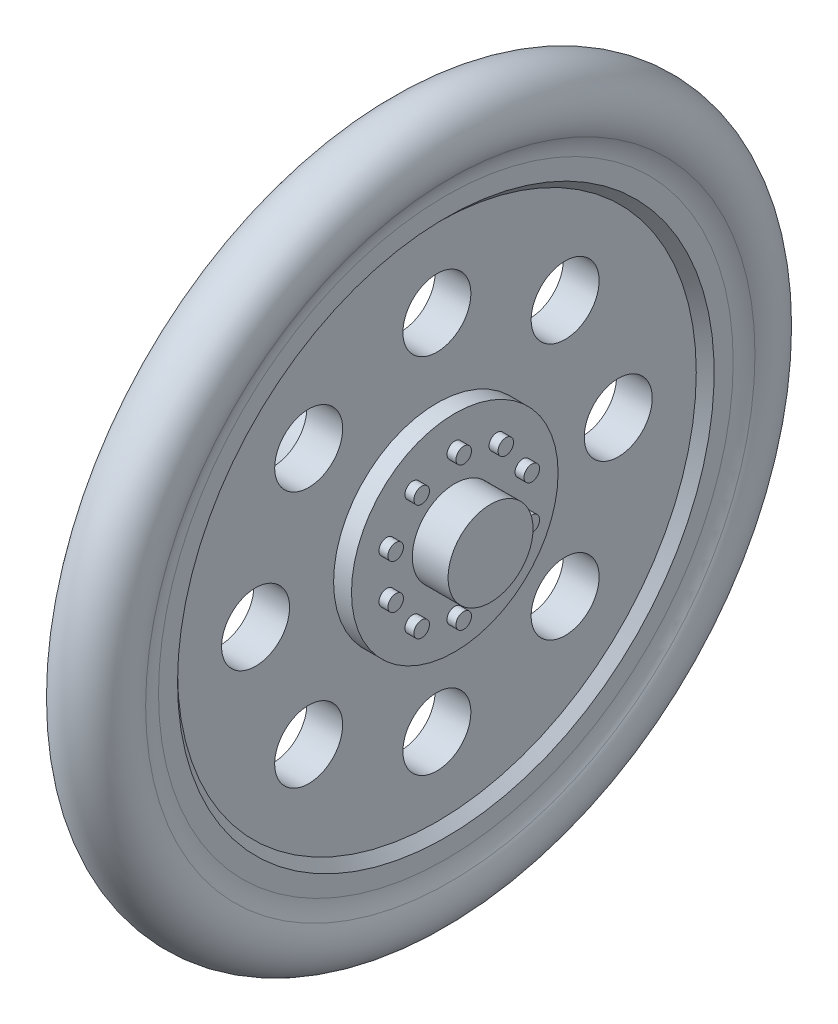
ISO-10303-21;
HEADER;
FILE_DESCRIPTION(('STEP AP214'),'2;1');
FILE_NAME('part.step','',(''),(''),'','','');
FILE_SCHEMA(('AUTOMOTIVE_DESIGN { 1 0 10303 214 1 1 1 1 }'));
ENDSEC;
DATA;
#1=APPLICATION_CONTEXT('core data for automotive mechanical design processes');
#2=APPLICATION_PROTOCOL_DEFINITION('international standard','automotive_design',2000,#1);
#3=PRODUCT_CONTEXT('',#1,'mechanical');
#4=PRODUCT('Part','Part','',(#3));
#5=PRODUCT_RELATED_PRODUCT_CATEGORY('part','',(#4));
#6=PRODUCT_DEFINITION_FORMATION('','',#4);
#7=PRODUCT_DEFINITION_CONTEXT('part definition',#1,'design');
#8=PRODUCT_DEFINITION('design','',#6,#7);
#9=PRODUCT_DEFINITION_SHAPE('','',#8);
#10=(LENGTH_UNIT() NAMED_UNIT(*) SI_UNIT(.MILLI.,.METRE.));
#11=(NAMED_UNIT(*) PLANE_ANGLE_UNIT() SI_UNIT($,.RADIAN.));
#12=(NAMED_UNIT(*) SI_UNIT($,.STERADIAN.) SOLID_ANGLE_UNIT());
#13=UNCERTAINTY_MEASURE_WITH_UNIT(LENGTH_MEASURE(1.E-05),#10,'distance_accuracy_value','');
#14=(GEOMETRIC_REPRESENTATION_CONTEXT(3) GLOBAL_UNCERTAINTY_ASSIGNED_CONTEXT((#13)) GLOBAL_UNIT_ASSIGNED_CONTEXT((#10,
#11,#12)) REPRESENTATION_CONTEXT('',''));
#15=CARTESIAN_POINT('',(0.,0.,0.));
#16=DIRECTION('',(0.,0.,1.));
#17=DIRECTION('',(1.,0.,0.));
#18=AXIS2_PLACEMENT_3D('',#15,#16,#17);
#19=CARTESIAN_POINT('',(10.5,0.,0.));
#20=DIRECTION('',(1.,0.,0.));
#21=DIRECTION('',(0.,0.,-1.));
#22=AXIS2_PLACEMENT_3D('',#19,#20,#21);
#23=PLANE('',#22);
#24=CARTESIAN_POINT('',(10.5,1.23606797749983,-3.8042260651806));
#25=DIRECTION('',(1.,0.,0.));
#26=DIRECTION('',(0.,-0.95105651629515,-0.309016994374958));
#27=AXIS2_PLACEMENT_3D('',#24,#25,#26);
#28=CIRCLE('',#27,0.435);
#29=CARTESIAN_POINT('',(10.5,0.822358392911443,-3.93864845773371));
#30=VERTEX_POINT('',#29);
#31=EDGE_CURVE('E100',#30,#30,#28,.T.);
#32=ORIENTED_EDGE('',*,*,#31,.F.);
#33=EDGE_LOOP('',(#32));
#34=FACE_BOUND('',#33,.T.);
#35=CARTESIAN_POINT('',(10.5,-3.23606797749977,-2.35114100916992));
#36=DIRECTION('',(1.,0.,0.));
#37=DIRECTION('',(0.,-0.58778525229248,0.809016994374942));
#38=AXIS2_PLACEMENT_3D('',#35,#36,#37);
#39=CIRCLE('',#38,0.435);
#40=CARTESIAN_POINT('',(10.5,-3.491754562247,-1.99921861661682));
#41=VERTEX_POINT('',#40);
#42=EDGE_CURVE('E112',#41,#41,#39,.T.);
#43=ORIENTED_EDGE('',*,*,#42,.F.);
#44=EDGE_LOOP('',(#43));
#45=FACE_BOUND('',#44,.T.);
#46=CARTESIAN_POINT('',(10.5,-3.2360679774998,2.35114100916987));
#47=DIRECTION('',(1.,0.,0.));
#48=DIRECTION('',(0.,0.587785252292469,0.809016994374951));
#49=AXIS2_PLACEMENT_3D('',#46,#47,#48);
#50=CIRCLE('',#49,0.435);
#51=CARTESIAN_POINT('',(10.5,-2.98038139275258,2.70306340172298));
#52=VERTEX_POINT('',#51);
#53=EDGE_CURVE('E124',#52,#52,#50,.T.);
#54=ORIENTED_EDGE('',*,*,#53,.F.);
#55=EDGE_LOOP('',(#54));
#56=FACE_BOUND('',#55,.T.);
#57=CARTESIAN_POINT('',(10.5,1.23606797749978,3.80422606518062));
#58=DIRECTION('',(1.,0.,0.));
#59=DIRECTION('',(0.,0.951056516295155,-0.309016994374945));
#60=AXIS2_PLACEMENT_3D('',#57,#58,#59);
#61=CIRCLE('',#60,0.435);
#62=CARTESIAN_POINT('',(10.5,1.64977756208817,3.66980367262752));
#63=VERTEX_POINT('',#62);
#64=EDGE_CURVE('E136',#63,#63,#61,.T.);
#65=ORIENTED_EDGE('',*,*,#64,.F.);
#66=EDGE_LOOP('',(#65));
#67=FACE_BOUND('',#66,.T.);
#68=CARTESIAN_POINT('',(10.5,4.,0.));
#69=DIRECTION('',(1.,0.,0.));
#70=DIRECTION('',(0.,0.,-1.));
#71=AXIS2_PLACEMENT_3D('',#68,#69,#70);
#72=CIRCLE('',#71,0.435);
#73=CARTESIAN_POINT('',(10.5,4.,-0.435));
#74=VERTEX_POINT('',#73);
#75=EDGE_CURVE('E148',#74,#74,#72,.T.);
#76=ORIENTED_EDGE('',*,*,#75,.F.);
#77=EDGE_LOOP('',(#76));
#78=FACE_BOUND('',#77,.T.);
#79=CARTESIAN_POINT('',(10.5,0.,0.));
#80=DIRECTION('',(1.,0.,0.));
#81=DIRECTION('',(0.,0.,-1.));
#82=AXIS2_PLACEMENT_3D('',#79,#80,#81);
#83=CIRCLE('',#82,5.775);
#84=CARTESIAN_POINT('',(10.5,0.,-5.775));
#85=VERTEX_POINT('',#84);
#86=EDGE_CURVE('E160',#85,#85,#83,.T.);
#87=ORIENTED_EDGE('',*,*,#86,.T.);
#88=EDGE_LOOP('',(#87));
#89=FACE_BOUND('',#88,.T.);
#90=CARTESIAN_POINT('',(10.5,0.,0.));
#91=DIRECTION('',(1.,0.,0.));
#92=DIRECTION('',(0.,0.,-1.));
#93=AXIS2_PLACEMENT_3D('',#90,#91,#92);
#94=CIRCLE('',#93,2.375);
#95=CARTESIAN_POINT('',(10.5,0.,-2.375));
#96=VERTEX_POINT('',#95);
#97=EDGE_CURVE('E154',#96,#96,#94,.T.);
#98=ORIENTED_EDGE('',*,*,#97,.F.);
#99=EDGE_LOOP('',(#98));
#100=FACE_BOUND('',#99,.T.);
#101=CARTESIAN_POINT('',(10.5,3.23606797749979,2.3511410091699));
#102=DIRECTION('',(1.,0.,0.));
#103=DIRECTION('',(0.,0.587785252292474,-0.809016994374947));
#104=AXIS2_PLACEMENT_3D('',#101,#102,#103);
#105=CIRCLE('',#104,0.435);
#106=CARTESIAN_POINT('',(10.5,3.49175456224701,1.9992186166168));
#107=VERTEX_POINT('',#106);
#108=EDGE_CURVE('E142',#107,#107,#105,.T.);
#109=ORIENTED_EDGE('',*,*,#108,.F.);
#110=EDGE_LOOP('',(#109));
#111=FACE_BOUND('',#110,.T.);
#112=CARTESIAN_POINT('',(10.5,-1.23606797749981,3.80422606518061));
#113=DIRECTION('',(1.,0.,0.));
#114=DIRECTION('',(0.,0.951056516295152,0.309016994374952));
#115=AXIS2_PLACEMENT_3D('',#112,#113,#114);
#116=CIRCLE('',#115,0.435);
#117=CARTESIAN_POINT('',(10.5,-0.822358392911415,3.93864845773371));
#118=VERTEX_POINT('',#117);
#119=EDGE_CURVE('E130',#118,#118,#116,.T.);
#120=ORIENTED_EDGE('',*,*,#119,.F.);
#121=EDGE_LOOP('',(#120));
#122=FACE_BOUND('',#121,.T.);
#123=CARTESIAN_POINT('',(10.5,-4.,0.));
#124=DIRECTION('',(1.,0.,0.));
#125=DIRECTION('',(0.,0.,1.));
#126=AXIS2_PLACEMENT_3D('',#123,#124,#125);
#127=CIRCLE('',#126,0.435);
#128=CARTESIAN_POINT('',(10.5,-4.,0.434999999999972));
#129=VERTEX_POINT('',#128);
#130=EDGE_CURVE('E118',#129,#129,#127,.T.);
#131=ORIENTED_EDGE('',*,*,#130,.F.);
#132=EDGE_LOOP('',(#131));
#133=FACE_BOUND('',#132,.T.);
#134=CARTESIAN_POINT('',(10.5,-1.23606797749975,-3.80422606518063));
#135=DIRECTION('',(1.,0.,0.));
#136=DIRECTION('',(0.,-0.951056516295157,0.309016994374938));
#137=AXIS2_PLACEMENT_3D('',#134,#135,#136);
#138=CIRCLE('',#137,0.435);
#139=CARTESIAN_POINT('',(10.5,-1.64977756208815,-3.66980367262753));
#140=VERTEX_POINT('',#139);
#141=EDGE_CURVE('E106',#140,#140,#138,.T.);
#142=ORIENTED_EDGE('',*,*,#141,.F.);
#143=EDGE_LOOP('',(#142));
#144=FACE_BOUND('',#143,.T.);
#145=CARTESIAN_POINT('',(10.5,3.23606797749982,-2.35114100916985));
#146=DIRECTION('',(1.,0.,0.));
#147=DIRECTION('',(0.,-0.587785252292462,-0.809016994374955));
#148=AXIS2_PLACEMENT_3D('',#145,#146,#147);
#149=CIRCLE('',#148,0.435);
#150=CARTESIAN_POINT('',(10.5,2.9803813927526,-2.70306340172296));
#151=VERTEX_POINT('',#150);
#152=EDGE_CURVE('E50',#151,#151,#149,.T.);
#153=ORIENTED_EDGE('',*,*,#152,.F.);
#154=EDGE_LOOP('',(#153));
#155=FACE_BOUND('',#154,.T.);
#156=ADVANCED_FACE('F30',(#34,#45,#56,#67,#78,#89,#100,#111,#122,#133,#144,#155),#23,.T.);
#157=CARTESIAN_POINT('',(9.5,14.5,0.));
#158=DIRECTION('',(-1.,0.,0.));
#159=DIRECTION('',(0.,0.,1.));
#160=AXIS2_PLACEMENT_3D('',#157,#158,#159);
#161=PLANE('',#160);
#162=CARTESIAN_POINT('',(9.5,7.16829499427871,-7.16829499427854));
#163=DIRECTION('',(1.,0.,0.));
#164=DIRECTION('',(0.,-0.707106781186539,-0.707106781186556));
#165=AXIS2_PLACEMENT_3D('',#162,#163,#164);
#166=CIRCLE('',#165,1.9);
#167=CARTESIAN_POINT('',(9.5,5.82479211002429,-8.511797878533));
#168=VERTEX_POINT('',#167);
#169=EDGE_CURVE('E83',#168,#168,#166,.T.);
#170=ORIENTED_EDGE('',*,*,#169,.F.);
#171=EDGE_LOOP('',(#170));
#172=FACE_BOUND('',#171,.T.);
#173=CARTESIAN_POINT('',(9.5,1.06184737719739E-13,-10.1375));
#174=DIRECTION('',(1.,0.,0.));
#175=DIRECTION('',(0.,-1.,0.));
#176=AXIS2_PLACEMENT_3D('',#173,#174,#175);
#177=CIRCLE('',#176,1.9);
#178=CARTESIAN_POINT('',(9.5,-1.8999999999999,-10.1375));
#179=VERTEX_POINT('',#178);
#180=EDGE_CURVE('E73',#179,#179,#177,.T.);
#181=ORIENTED_EDGE('',*,*,#180,.F.);
#182=EDGE_LOOP('',(#181));
#183=FACE_BOUND('',#182,.T.);
#184=CARTESIAN_POINT('',(9.5,-7.16829499427856,-7.16829499427869));
#185=DIRECTION('',(1.,0.,0.));
#186=DIRECTION('',(0.,-0.707106781186554,0.707106781186541));
#187=AXIS2_PLACEMENT_3D('',#184,#185,#186);
#188=CIRCLE('',#187,1.9);
#189=CARTESIAN_POINT('',(9.5,-8.51179787853301,-5.82479211002426));
#190=VERTEX_POINT('',#189);
#191=EDGE_CURVE('E70',#190,#190,#188,.T.);
#192=ORIENTED_EDGE('',*,*,#191,.F.);
#193=EDGE_LOOP('',(#192));
#194=FACE_BOUND('',#193,.T.);
#195=CARTESIAN_POINT('',(9.5,-10.1375,0.));
#196=DIRECTION('',(1.,0.,0.));
#197=DIRECTION('',(0.,0.,1.));
#198=AXIS2_PLACEMENT_3D('',#195,#196,#197);
#199=CIRCLE('',#198,1.9);
#200=CARTESIAN_POINT('',(9.5,-10.1375,1.89999999999993));
#201=VERTEX_POINT('',#200);
#202=EDGE_CURVE('E67',#201,#201,#199,.T.);
#203=ORIENTED_EDGE('',*,*,#202,.F.);
#204=EDGE_LOOP('',(#203));
#205=FACE_BOUND('',#204,.T.);
#206=CARTESIAN_POINT('',(9.5,-7.16829499427866,7.16829499427859));
#207=DIRECTION('',(1.,0.,0.));
#208=DIRECTION('',(0.,0.707106781186544,0.707106781186551));
#209=AXIS2_PLACEMENT_3D('',#206,#207,#208);
#210=CIRCLE('',#209,1.9);
#211=CARTESIAN_POINT('',(9.5,-5.82479211002423,8.51179787853304));
#212=VERTEX_POINT('',#211);
#213=EDGE_CURVE('E63',#212,#212,#210,.T.);
#214=ORIENTED_EDGE('',*,*,#213,.F.);
#215=EDGE_LOOP('',(#214));
#216=FACE_BOUND('',#215,.T.);
#217=CARTESIAN_POINT('',(9.5,0.,10.1375));
#218=DIRECTION('',(1.,0.,0.));
#219=DIRECTION('',(0.,1.,0.));
#220=AXIS2_PLACEMENT_3D('',#217,#218,#219);
#221=CIRCLE('',#220,1.9);
#222=CARTESIAN_POINT('',(9.5,1.89999999999997,10.1375));
#223=VERTEX_POINT('',#222);
#224=EDGE_CURVE('E59',#223,#223,#221,.T.);
#225=ORIENTED_EDGE('',*,*,#224,.F.);
#226=EDGE_LOOP('',(#225));
#227=FACE_BOUND('',#226,.T.);
#228=CARTESIAN_POINT('',(9.5,7.16829499427861,7.16829499427864));
#229=DIRECTION('',(1.,0.,0.));
#230=DIRECTION('',(0.,0.707106781186549,-0.707106781186546));
#231=AXIS2_PLACEMENT_3D('',#228,#229,#230);
#232=CIRCLE('',#231,1.9);
#233=CARTESIAN_POINT('',(9.5,8.51179787853306,5.8247921100242));
#234=VERTEX_POINT('',#233);
#235=EDGE_CURVE('E55',#234,#234,#232,.T.);
#236=ORIENTED_EDGE('',*,*,#235,.F.);
#237=EDGE_LOOP('',(#236));
#238=FACE_BOUND('',#237,.T.);
#239=CARTESIAN_POINT('',(9.5,10.1375,0.));
#240=DIRECTION('',(1.,0.,0.));
#241=DIRECTION('',(0.,0.,-1.));
#242=AXIS2_PLACEMENT_3D('',#239,#240,#241);
#243=CIRCLE('',#242,1.9);
#244=CARTESIAN_POINT('',(9.5,10.1375,-1.9));
#245=VERTEX_POINT('',#244);
#246=EDGE_CURVE('E51',#245,#245,#243,.T.);
#247=ORIENTED_EDGE('',*,*,#246,.F.);
#248=EDGE_LOOP('',(#247));
#249=FACE_BOUND('',#248,.T.);
#250=CARTESIAN_POINT('',(9.5,0.,0.));
#251=DIRECTION('',(-1.,0.,0.));
#252=DIRECTION('',(0.,0.,1.));
#253=AXIS2_PLACEMENT_3D('',#250,#251,#252);
#254=CIRCLE('',#253,14.5);
#255=CARTESIAN_POINT('',(9.5,0.,14.5));
#256=VERTEX_POINT('',#255);
#257=EDGE_CURVE('E180',#256,#256,#254,.T.);
#258=ORIENTED_EDGE('',*,*,#257,.F.);
#259=EDGE_LOOP('',(#258));
#260=FACE_BOUND('',#259,.T.);
#261=CARTESIAN_POINT('',(9.5,0.,0.));
#262=DIRECTION('',(-1.,0.,0.));
#263=DIRECTION('',(0.,0.,1.));
#264=AXIS2_PLACEMENT_3D('',#261,#262,#263);
#265=CIRCLE('',#264,5.775);
#266=CARTESIAN_POINT('',(9.5,0.,5.775));
#267=VERTEX_POINT('',#266);
#268=EDGE_CURVE('E11',#267,#267,#265,.F.);
#269=ORIENTED_EDGE('',*,*,#268,.F.);
#270=EDGE_LOOP('',(#269));
#271=FACE_BOUND('',#270,.T.);
#272=ADVANCED_FACE('F218',(#172,#183,#194,#205,#216,#227,#238,#249,#260,#271),#161,.F.);
#273=CARTESIAN_POINT('',(0.,0.,0.));
#274=DIRECTION('',(1.,0.,0.));
#275=DIRECTION('',(0.,0.,-1.));
#276=AXIS2_PLACEMENT_3D('',#273,#274,#275);
#277=PLANE('',#276);
#278=CARTESIAN_POINT('',(0.,0.,0.));
#279=DIRECTION('',(-1.,0.,0.));
#280=DIRECTION('',(0.,0.,1.));
#281=AXIS2_PLACEMENT_3D('',#278,#279,#280);
#282=CIRCLE('',#281,1.63);
#283=CARTESIAN_POINT('',(0.,0.,1.63));
#284=VERTEX_POINT('',#283);
#285=EDGE_CURVE('E636',#284,#284,#282,.T.);
#286=ORIENTED_EDGE('',*,*,#285,.F.);
#287=EDGE_LOOP('',(#286));
#288=FACE_BOUND('',#287,.T.);
#289=CARTESIAN_POINT('',(0.,0.,0.));
#290=DIRECTION('',(-1.,0.,0.));
#291=DIRECTION('',(0.,0.,1.));
#292=AXIS2_PLACEMENT_3D('',#289,#290,#291);
#293=CIRCLE('',#292,3.1);
#294=CARTESIAN_POINT('',(0.,0.,3.1));
#295=VERTEX_POINT('',#294);
#296=EDGE_CURVE('E165',#295,#295,#293,.T.);
#297=ORIENTED_EDGE('',*,*,#296,.T.);
#298=EDGE_LOOP('',(#297));
#299=FACE_BOUND('',#298,.T.);
#300=ADVANCED_FACE('F224',(#288,#299),#277,.F.);
#301=CARTESIAN_POINT('',(9.5,0.,0.));
#302=DIRECTION('',(1.,0.,0.));
#303=DIRECTION('',(0.,0.,-1.));
#304=AXIS2_PLACEMENT_3D('',#301,#302,#303);
#305=CONICAL_SURFACE('',#304,14.5,0.785398163397455);
#306=CARTESIAN_POINT('',(10.,0.,0.));
#307=DIRECTION('',(-1.,0.,0.));
#308=DIRECTION('',(0.,0.,1.));
#309=AXIS2_PLACEMENT_3D('',#306,#307,#308);
#310=CIRCLE('',#309,15.);
#311=CARTESIAN_POINT('',(10.,0.,15.));
#312=VERTEX_POINT('',#311);
#313=EDGE_CURVE('E177',#312,#312,#310,.T.);
#314=ORIENTED_EDGE('',*,*,#313,.F.);
#315=EDGE_LOOP('',(#314));
#316=FACE_BOUND('',#315,.T.);
#317=ORIENTED_EDGE('',*,*,#257,.T.);
#318=EDGE_LOOP('',(#317));
#319=FACE_BOUND('',#318,.T.);
#320=ADVANCED_FACE('F248',(#316,#319),#305,.F.);
#321=CARTESIAN_POINT('',(10.,16.6771243444677,0.));
#322=DIRECTION('',(-1.,0.,0.));
#323=DIRECTION('',(0.,0.,1.));
#324=AXIS2_PLACEMENT_3D('',#321,#322,#323);
#325=PLANE('',#324);
#326=CARTESIAN_POINT('',(10.,0.,0.));
#327=DIRECTION('',(-1.,0.,0.));
#328=DIRECTION('',(0.,0.,1.));
#329=AXIS2_PLACEMENT_3D('',#326,#327,#328);
#330=CIRCLE('',#329,16.0635083268963);
#331=CARTESIAN_POINT('',(10.,0.,16.0635083268963));
#332=VERTEX_POINT('',#331);
#333=EDGE_CURVE('E38',#332,#332,#330,.F.);
#334=ORIENTED_EDGE('',*,*,#333,.T.);
#335=EDGE_LOOP('',(#334));
#336=FACE_BOUND('',#335,.T.);
#337=ORIENTED_EDGE('',*,*,#313,.T.);
#338=EDGE_LOOP('',(#337));
#339=FACE_BOUND('',#338,.T.);
#340=ADVANCED_FACE('F254',(#336,#339),#325,.F.);
#341=CARTESIAN_POINT('',(8.5,0.,0.));
#342=DIRECTION('',(-1.,0.,0.));
#343=DIRECTION('',(0.,0.,1.));
#344=AXIS2_PLACEMENT_3D('',#341,#342,#343);
#345=TOROIDAL_SURFACE('',#344,18.,2.);
#346=CARTESIAN_POINT('',(6.75000000000013,0.,0.));
#347=DIRECTION('',(1.,0.,0.));
#348=DIRECTION('',(0.,0.,-1.));
#349=AXIS2_PLACEMENT_3D('',#346,#347,#348);
#350=CIRCLE('',#349,17.0317541634482);
#351=CARTESIAN_POINT('',(6.75000000000013,0.,-17.0317541634482));
#352=VERTEX_POINT('',#351);
#353=EDGE_CURVE('E43',#352,#352,#350,.T.);
#354=ORIENTED_EDGE('',*,*,#353,.T.);
#355=EDGE_LOOP('',(#354));
#356=FACE_BOUND('',#355,.T.);
#357=CARTESIAN_POINT('',(10.2499999999999,0.,0.));
#358=DIRECTION('',(-1.,0.,0.));
#359=DIRECTION('',(0.,0.,1.));
#360=AXIS2_PLACEMENT_3D('',#357,#358,#359);
#361=CIRCLE('',#360,17.0317541634482);
#362=CARTESIAN_POINT('',(10.2499999999999,0.,17.0317541634482));
#363=VERTEX_POINT('',#362);
#364=EDGE_CURVE('E186',#363,#363,#361,.T.);
#365=ORIENTED_EDGE('',*,*,#364,.T.);
#366=EDGE_LOOP('',(#365));
#367=FACE_BOUND('',#366,.T.);
#368=ADVANCED_FACE('F191',(#356,#367),#345,.T.);
#369=CARTESIAN_POINT('',(7.,16.6771243444677,0.));
#370=DIRECTION('',(1.,0.,0.));
#371=DIRECTION('',(0.,0.,-1.));
#372=AXIS2_PLACEMENT_3D('',#369,#370,#371);
#373=PLANE('',#372);
#374=CARTESIAN_POINT('',(7.,0.,0.));
#375=DIRECTION('',(1.,0.,0.));
#376=DIRECTION('',(0.,0.,-1.));
#377=AXIS2_PLACEMENT_3D('',#374,#375,#376);
#378=CIRCLE('',#377,16.0635083268963);
#379=CARTESIAN_POINT('',(7.,0.,-16.0635083268963));
#380=VERTEX_POINT('',#379);
#381=EDGE_CURVE('E183',#380,#380,#378,.F.);
#382=ORIENTED_EDGE('',*,*,#381,.T.);
#383=EDGE_LOOP('',(#382));
#384=FACE_BOUND('',#383,.T.);
#385=CARTESIAN_POINT('',(7.,0.,0.));
#386=DIRECTION('',(-1.,0.,0.));
#387=DIRECTION('',(0.,0.,1.));
#388=AXIS2_PLACEMENT_3D('',#385,#386,#387);
#389=CIRCLE('',#388,15.);
#390=CARTESIAN_POINT('',(7.,0.,15.));
#391=VERTEX_POINT('',#390);
#392=EDGE_CURVE('E174',#391,#391,#389,.T.);
#393=ORIENTED_EDGE('',*,*,#392,.F.);
#394=EDGE_LOOP('',(#393));
#395=FACE_BOUND('',#394,.T.);
#396=ADVANCED_FACE('F200',(#384,#395),#373,.F.);
#397=CARTESIAN_POINT('',(7.,0.,0.));
#398=DIRECTION('',(-1.,0.,0.));
#399=DIRECTION('',(0.,0.,1.));
#400=AXIS2_PLACEMENT_3D('',#397,#398,#399);
#401=CONICAL_SURFACE('',#400,15.,0.785398163397453);
#402=CARTESIAN_POINT('',(7.5,0.,0.));
#403=DIRECTION('',(-1.,0.,0.));
#404=DIRECTION('',(0.,0.,1.));
#405=AXIS2_PLACEMENT_3D('',#402,#403,#404);
#406=CIRCLE('',#405,14.5);
#407=CARTESIAN_POINT('',(7.5,0.,14.5));
#408=VERTEX_POINT('',#407);
#409=EDGE_CURVE('E171',#408,#408,#406,.T.);
#410=ORIENTED_EDGE('',*,*,#409,.F.);
#411=EDGE_LOOP('',(#410));
#412=FACE_BOUND('',#411,.T.);
#413=ORIENTED_EDGE('',*,*,#392,.T.);
#414=EDGE_LOOP('',(#413));
#415=FACE_BOUND('',#414,.T.);
#416=ADVANCED_FACE('F203',(#412,#415),#401,.F.);
#417=CARTESIAN_POINT('',(7.5,3.1,0.));
#418=DIRECTION('',(1.,0.,0.));
#419=DIRECTION('',(0.,0.,-1.));
#420=AXIS2_PLACEMENT_3D('',#417,#418,#419);
#421=PLANE('',#420);
#422=CARTESIAN_POINT('',(7.5,7.16829499427871,-7.16829499427854));
#423=DIRECTION('',(1.,0.,0.));
#424=DIRECTION('',(0.,0.,-1.));
#425=AXIS2_PLACEMENT_3D('',#422,#423,#424);
#426=CIRCLE('',#425,1.9);
#427=CARTESIAN_POINT('',(7.5,7.16829499427871,-9.06829499427854));
#428=VERTEX_POINT('',#427);
#429=EDGE_CURVE('E34',#428,#428,#426,.T.);
#430=ORIENTED_EDGE('',*,*,#429,.T.);
#431=EDGE_LOOP('',(#430));
#432=FACE_BOUND('',#431,.T.);
#433=CARTESIAN_POINT('',(7.5,1.06184737719739E-13,-10.1375));
#434=DIRECTION('',(1.,0.,0.));
#435=DIRECTION('',(0.,0.,-1.));
#436=AXIS2_PLACEMENT_3D('',#433,#434,#435);
#437=CIRCLE('',#436,1.9);
#438=CARTESIAN_POINT('',(7.5,1.06184737719739E-13,-12.0375));
#439=VERTEX_POINT('',#438);
#440=EDGE_CURVE('E71',#439,#439,#437,.T.);
#441=ORIENTED_EDGE('',*,*,#440,.T.);
#442=EDGE_LOOP('',(#441));
#443=FACE_BOUND('',#442,.T.);
#444=CARTESIAN_POINT('',(7.5,-7.16829499427856,-7.16829499427869));
#445=DIRECTION('',(1.,0.,0.));
#446=DIRECTION('',(0.,0.,-1.));
#447=AXIS2_PLACEMENT_3D('',#444,#445,#446);
#448=CIRCLE('',#447,1.9);
#449=CARTESIAN_POINT('',(7.5,-7.16829499427856,-9.06829499427869));
#450=VERTEX_POINT('',#449);
#451=EDGE_CURVE('E68',#450,#450,#448,.T.);
#452=ORIENTED_EDGE('',*,*,#451,.T.);
#453=EDGE_LOOP('',(#452));
#454=FACE_BOUND('',#453,.T.);
#455=CARTESIAN_POINT('',(7.5,-10.1375,0.));
#456=DIRECTION('',(1.,0.,0.));
#457=DIRECTION('',(0.,0.,-1.));
#458=AXIS2_PLACEMENT_3D('',#455,#456,#457);
#459=CIRCLE('',#458,1.9);
#460=CARTESIAN_POINT('',(7.5,-10.1375,-1.90000000000007));
#461=VERTEX_POINT('',#460);
#462=EDGE_CURVE('E64',#461,#461,#459,.T.);
#463=ORIENTED_EDGE('',*,*,#462,.T.);
#464=EDGE_LOOP('',(#463));
#465=FACE_BOUND('',#464,.T.);
#466=CARTESIAN_POINT('',(7.5,-7.16829499427866,7.16829499427859));
#467=DIRECTION('',(1.,0.,0.));
#468=DIRECTION('',(0.,0.,-1.));
#469=AXIS2_PLACEMENT_3D('',#466,#467,#468);
#470=CIRCLE('',#469,1.9);
#471=CARTESIAN_POINT('',(7.5,-7.16829499427866,5.26829499427858));
#472=VERTEX_POINT('',#471);
#473=EDGE_CURVE('E60',#472,#472,#470,.T.);
#474=ORIENTED_EDGE('',*,*,#473,.T.);
#475=EDGE_LOOP('',(#474));
#476=FACE_BOUND('',#475,.T.);
#477=CARTESIAN_POINT('',(7.5,0.,10.1375));
#478=DIRECTION('',(1.,0.,0.));
#479=DIRECTION('',(0.,0.,-1.));
#480=AXIS2_PLACEMENT_3D('',#477,#478,#479);
#481=CIRCLE('',#480,1.9);
#482=CARTESIAN_POINT('',(7.5,0.,8.2375));
#483=VERTEX_POINT('',#482);
#484=EDGE_CURVE('E56',#483,#483,#481,.T.);
#485=ORIENTED_EDGE('',*,*,#484,.T.);
#486=EDGE_LOOP('',(#485));
#487=FACE_BOUND('',#486,.T.);
#488=CARTESIAN_POINT('',(7.5,7.16829499427861,7.16829499427864));
#489=DIRECTION('',(1.,0.,0.));
#490=DIRECTION('',(0.,0.,-1.));
#491=AXIS2_PLACEMENT_3D('',#488,#489,#490);
#492=CIRCLE('',#491,1.9);
#493=CARTESIAN_POINT('',(7.5,7.16829499427861,5.26829499427863));
#494=VERTEX_POINT('',#493);
#495=EDGE_CURVE('E52',#494,#494,#492,.T.);
#496=ORIENTED_EDGE('',*,*,#495,.T.);
#497=EDGE_LOOP('',(#496));
#498=FACE_BOUND('',#497,.T.);
#499=CARTESIAN_POINT('',(7.5,10.1375,0.));
#500=DIRECTION('',(1.,0.,0.));
#501=DIRECTION('',(0.,0.,-1.));
#502=AXIS2_PLACEMENT_3D('',#499,#500,#501);
#503=CIRCLE('',#502,1.9);
#504=CARTESIAN_POINT('',(7.5,10.1375,-1.9));
#505=VERTEX_POINT('',#504);
#506=EDGE_CURVE('E47',#505,#505,#503,.T.);
#507=ORIENTED_EDGE('',*,*,#506,.T.);
#508=EDGE_LOOP('',(#507));
#509=FACE_BOUND('',#508,.T.);
#510=CARTESIAN_POINT('',(7.5,0.,0.));
#511=DIRECTION('',(-1.,0.,0.));
#512=DIRECTION('',(0.,0.,1.));
#513=AXIS2_PLACEMENT_3D('',#510,#511,#512);
#514=CIRCLE('',#513,3.1);
#515=CARTESIAN_POINT('',(7.5,0.,3.1));
#516=VERTEX_POINT('',#515);
#517=EDGE_CURVE('E168',#516,#516,#514,.T.);
#518=ORIENTED_EDGE('',*,*,#517,.F.);
#519=EDGE_LOOP('',(#518));
#520=FACE_BOUND('',#519,.T.);
#521=ORIENTED_EDGE('',*,*,#409,.T.);
#522=EDGE_LOOP('',(#521));
#523=FACE_BOUND('',#522,.T.);
#524=ADVANCED_FACE('F208',(#432,#443,#454,#465,#476,#487,#498,#509,#520,#523),#421,.F.);
#525=CARTESIAN_POINT('',(0.,0.,0.));
#526=DIRECTION('',(-1.,0.,0.));
#527=DIRECTION('',(0.,0.,1.));
#528=AXIS2_PLACEMENT_3D('',#525,#526,#527);
#529=CYLINDRICAL_SURFACE('',#528,3.1);
#530=ORIENTED_EDGE('',*,*,#296,.F.);
#531=EDGE_LOOP('',(#530));
#532=FACE_BOUND('',#531,.T.);
#533=ORIENTED_EDGE('',*,*,#517,.T.);
#534=EDGE_LOOP('',(#533));
#535=FACE_BOUND('',#534,.T.);
#536=ADVANCED_FACE('F197',(#532,#535),#529,.T.);
#537=CARTESIAN_POINT('',(5.,0.,0.));
#538=DIRECTION('',(-1.,0.,0.));
#539=DIRECTION('',(0.,0.,1.));
#540=AXIS2_PLACEMENT_3D('',#537,#538,#539);
#541=TOROIDAL_SURFACE('',#540,16.0635083268963,2.);
#542=ORIENTED_EDGE('',*,*,#353,.F.);
#543=EDGE_LOOP('',(#542));
#544=FACE_BOUND('',#543,.T.);
#545=ORIENTED_EDGE('',*,*,#381,.F.);
#546=EDGE_LOOP('',(#545));
#547=FACE_BOUND('',#546,.T.);
#548=ADVANCED_FACE('F194',(#544,#547),#541,.F.);
#549=CARTESIAN_POINT('',(12.,0.,0.));
#550=DIRECTION('',(1.,0.,0.));
#551=DIRECTION('',(0.,0.,-1.));
#552=AXIS2_PLACEMENT_3D('',#549,#550,#551);
#553=TOROIDAL_SURFACE('',#552,16.0635083268963,2.);
#554=ORIENTED_EDGE('',*,*,#333,.F.);
#555=EDGE_LOOP('',(#554));
#556=FACE_BOUND('',#555,.T.);
#557=ORIENTED_EDGE('',*,*,#364,.F.);
#558=EDGE_LOOP('',(#557));
#559=FACE_BOUND('',#558,.T.);
#560=ADVANCED_FACE('F32',(#556,#559),#553,.F.);
#561=CARTESIAN_POINT('',(10.5,0.,0.));
#562=DIRECTION('',(-1.,0.,0.));
#563=DIRECTION('',(0.,0.,1.));
#564=AXIS2_PLACEMENT_3D('',#561,#562,#563);
#565=CYLINDRICAL_SURFACE('',#564,5.775);
#566=ORIENTED_EDGE('',*,*,#86,.F.);
#567=EDGE_LOOP('',(#566));
#568=FACE_BOUND('',#567,.T.);
#569=ORIENTED_EDGE('',*,*,#268,.T.);
#570=EDGE_LOOP('',(#569));
#571=FACE_BOUND('',#570,.T.);
#572=ADVANCED_FACE('F233',(#568,#571),#565,.T.);
#573=CARTESIAN_POINT('',(12.5,0.,0.));
#574=DIRECTION('',(-1.,0.,0.));
#575=DIRECTION('',(0.,0.,1.));
#576=AXIS2_PLACEMENT_3D('',#573,#574,#575);
#577=CYLINDRICAL_SURFACE('',#576,2.375);
#578=CARTESIAN_POINT('',(12.5,0.,0.));
#579=DIRECTION('',(1.,0.,0.));
#580=DIRECTION('',(0.,0.,-1.));
#581=AXIS2_PLACEMENT_3D('',#578,#579,#580);
#582=CIRCLE('',#581,2.375);
#583=CARTESIAN_POINT('',(12.5,0.,-2.375));
#584=VERTEX_POINT('',#583);
#585=EDGE_CURVE('E157',#584,#584,#582,.T.);
#586=ORIENTED_EDGE('',*,*,#585,.F.);
#587=EDGE_LOOP('',(#586));
#588=FACE_BOUND('',#587,.T.);
#589=ORIENTED_EDGE('',*,*,#97,.T.);
#590=EDGE_LOOP('',(#589));
#591=FACE_BOUND('',#590,.T.);
#592=ADVANCED_FACE('F231',(#588,#591),#577,.T.);
#593=CARTESIAN_POINT('',(12.5,0.,0.));
#594=DIRECTION('',(1.,0.,0.));
#595=DIRECTION('',(0.,0.,-1.));
#596=AXIS2_PLACEMENT_3D('',#593,#594,#595);
#597=PLANE('',#596);
#598=ORIENTED_EDGE('',*,*,#585,.T.);
#599=EDGE_LOOP('',(#598));
#600=FACE_BOUND('',#599,.T.);
#601=ADVANCED_FACE('F303',(#600),#597,.T.);
#602=CARTESIAN_POINT('',(11.,4.,0.));
#603=DIRECTION('',(-1.,0.,0.));
#604=DIRECTION('',(0.,0.,1.));
#605=AXIS2_PLACEMENT_3D('',#602,#603,#604);
#606=CYLINDRICAL_SURFACE('',#605,0.435);
#607=CARTESIAN_POINT('',(11.,4.,0.));
#608=DIRECTION('',(1.,0.,0.));
#609=DIRECTION('',(0.,0.,-1.));
#610=AXIS2_PLACEMENT_3D('',#607,#608,#609);
#611=CIRCLE('',#610,0.435);
#612=CARTESIAN_POINT('',(11.,4.,-0.435));
#613=VERTEX_POINT('',#612);
#614=EDGE_CURVE('E151',#613,#613,#611,.T.);
#615=ORIENTED_EDGE('',*,*,#614,.F.);
#616=EDGE_LOOP('',(#615));
#617=FACE_BOUND('',#616,.T.);
#618=ORIENTED_EDGE('',*,*,#75,.T.);
#619=EDGE_LOOP('',(#618));
#620=FACE_BOUND('',#619,.T.);
#621=ADVANCED_FACE('F312',(#617,#620),#606,.T.);
#622=CARTESIAN_POINT('',(11.,4.,0.));
#623=DIRECTION('',(1.,0.,0.));
#624=DIRECTION('',(0.,0.,-1.));
#625=AXIS2_PLACEMENT_3D('',#622,#623,#624);
#626=PLANE('',#625);
#627=ORIENTED_EDGE('',*,*,#614,.T.);
#628=EDGE_LOOP('',(#627));
#629=FACE_BOUND('',#628,.T.);
#630=ADVANCED_FACE('F321',(#629),#626,.T.);
#631=CARTESIAN_POINT('',(11.,3.23606797749979,2.3511410091699));
#632=DIRECTION('',(-1.,0.,0.));
#633=DIRECTION('',(0.,0.,1.));
#634=AXIS2_PLACEMENT_3D('',#631,#632,#633);
#635=CYLINDRICAL_SURFACE('',#634,0.435);
#636=CARTESIAN_POINT('',(11.,3.23606797749979,2.3511410091699));
#637=DIRECTION('',(1.,0.,0.));
#638=DIRECTION('',(0.,0.587785252292474,-0.809016994374947));
#639=AXIS2_PLACEMENT_3D('',#636,#637,#638);
#640=CIRCLE('',#639,0.435);
#641=CARTESIAN_POINT('',(11.,3.49175456224701,1.9992186166168));
#642=VERTEX_POINT('',#641);
#643=EDGE_CURVE('E145',#642,#642,#640,.T.);
#644=ORIENTED_EDGE('',*,*,#643,.F.);
#645=EDGE_LOOP('',(#644));
#646=FACE_BOUND('',#645,.T.);
#647=ORIENTED_EDGE('',*,*,#108,.T.);
#648=EDGE_LOOP('',(#647));
#649=FACE_BOUND('',#648,.T.);
#650=ADVANCED_FACE('F330',(#646,#649),#635,.T.);
#651=CARTESIAN_POINT('',(11.,3.23606797749979,2.3511410091699));
#652=DIRECTION('',(1.,0.,0.));
#653=DIRECTION('',(0.,0.587785252292474,-0.809016994374947));
#654=AXIS2_PLACEMENT_3D('',#651,#652,#653);
#655=PLANE('',#654);
#656=ORIENTED_EDGE('',*,*,#643,.T.);
#657=EDGE_LOOP('',(#656));
#658=FACE_BOUND('',#657,.T.);
#659=ADVANCED_FACE('F345',(#658),#655,.T.);
#660=CARTESIAN_POINT('',(11.,1.23606797749978,3.80422606518062));
#661=DIRECTION('',(-1.,0.,0.));
#662=DIRECTION('',(0.,0.,1.));
#663=AXIS2_PLACEMENT_3D('',#660,#661,#662);
#664=CYLINDRICAL_SURFACE('',#663,0.435);
#665=CARTESIAN_POINT('',(11.,1.23606797749978,3.80422606518062));
#666=DIRECTION('',(1.,0.,0.));
#667=DIRECTION('',(0.,0.951056516295155,-0.309016994374945));
#668=AXIS2_PLACEMENT_3D('',#665,#666,#667);
#669=CIRCLE('',#668,0.435);
#670=CARTESIAN_POINT('',(11.,1.64977756208817,3.66980367262752));
#671=VERTEX_POINT('',#670);
#672=EDGE_CURVE('E139',#671,#671,#669,.T.);
#673=ORIENTED_EDGE('',*,*,#672,.F.);
#674=EDGE_LOOP('',(#673));
#675=FACE_BOUND('',#674,.T.);
#676=ORIENTED_EDGE('',*,*,#64,.T.);
#677=EDGE_LOOP('',(#676));
#678=FACE_BOUND('',#677,.T.);
#679=ADVANCED_FACE('F355',(#675,#678),#664,.T.);
#680=CARTESIAN_POINT('',(11.,1.23606797749978,3.80422606518062));
#681=DIRECTION('',(1.,0.,0.));
#682=DIRECTION('',(0.,0.951056516295155,-0.309016994374945));
#683=AXIS2_PLACEMENT_3D('',#680,#681,#682);
#684=PLANE('',#683);
#685=ORIENTED_EDGE('',*,*,#672,.T.);
#686=EDGE_LOOP('',(#685));
#687=FACE_BOUND('',#686,.T.);
#688=ADVANCED_FACE('F365',(#687),#684,.T.);
#689=CARTESIAN_POINT('',(11.,-1.23606797749981,3.80422606518061));
#690=DIRECTION('',(-1.,0.,0.));
#691=DIRECTION('',(0.,0.,1.));
#692=AXIS2_PLACEMENT_3D('',#689,#690,#691);
#693=CYLINDRICAL_SURFACE('',#692,0.435);
#694=CARTESIAN_POINT('',(11.,-1.23606797749981,3.80422606518061));
#695=DIRECTION('',(1.,0.,0.));
#696=DIRECTION('',(0.,0.951056516295152,0.309016994374952));
#697=AXIS2_PLACEMENT_3D('',#694,#695,#696);
#698=CIRCLE('',#697,0.435);
#699=CARTESIAN_POINT('',(11.,-0.822358392911415,3.93864845773371));
#700=VERTEX_POINT('',#699);
#701=EDGE_CURVE('E133',#700,#700,#698,.T.);
#702=ORIENTED_EDGE('',*,*,#701,.F.);
#703=EDGE_LOOP('',(#702));
#704=FACE_BOUND('',#703,.T.);
#705=ORIENTED_EDGE('',*,*,#119,.T.);
#706=EDGE_LOOP('',(#705));
#707=FACE_BOUND('',#706,.T.);
#708=ADVANCED_FACE('F375',(#704,#707),#693,.T.);
#709=CARTESIAN_POINT('',(11.,-1.23606797749981,3.80422606518061));
#710=DIRECTION('',(1.,0.,0.));
#711=DIRECTION('',(0.,0.951056516295152,0.309016994374952));
#712=AXIS2_PLACEMENT_3D('',#709,#710,#711);
#713=PLANE('',#712);
#714=ORIENTED_EDGE('',*,*,#701,.T.);
#715=EDGE_LOOP('',(#714));
#716=FACE_BOUND('',#715,.T.);
#717=ADVANCED_FACE('F385',(#716),#713,.T.);
#718=CARTESIAN_POINT('',(11.,-3.2360679774998,2.35114100916987));
#719=DIRECTION('',(-1.,0.,0.));
#720=DIRECTION('',(0.,0.,1.));
#721=AXIS2_PLACEMENT_3D('',#718,#719,#720);
#722=CYLINDRICAL_SURFACE('',#721,0.435);
#723=CARTESIAN_POINT('',(11.,-3.2360679774998,2.35114100916987));
#724=DIRECTION('',(1.,0.,0.));
#725=DIRECTION('',(0.,0.587785252292469,0.809016994374951));
#726=AXIS2_PLACEMENT_3D('',#723,#724,#725);
#727=CIRCLE('',#726,0.435);
#728=CARTESIAN_POINT('',(11.,-2.98038139275258,2.70306340172298));
#729=VERTEX_POINT('',#728);
#730=EDGE_CURVE('E127',#729,#729,#727,.T.);
#731=ORIENTED_EDGE('',*,*,#730,.F.);
#732=EDGE_LOOP('',(#731));
#733=FACE_BOUND('',#732,.T.);
#734=ORIENTED_EDGE('',*,*,#53,.T.);
#735=EDGE_LOOP('',(#734));
#736=FACE_BOUND('',#735,.T.);
#737=ADVANCED_FACE('F395',(#733,#736),#722,.T.);
#738=CARTESIAN_POINT('',(11.,-3.2360679774998,2.35114100916987));
#739=DIRECTION('',(1.,0.,0.));
#740=DIRECTION('',(0.,0.587785252292469,0.809016994374951));
#741=AXIS2_PLACEMENT_3D('',#738,#739,#740);
#742=PLANE('',#741);
#743=ORIENTED_EDGE('',*,*,#730,.T.);
#744=EDGE_LOOP('',(#743));
#745=FACE_BOUND('',#744,.T.);
#746=ADVANCED_FACE('F405',(#745),#742,.T.);
#747=CARTESIAN_POINT('',(11.,-4.,0.));
#748=DIRECTION('',(-1.,0.,0.));
#749=DIRECTION('',(0.,0.,1.));
#750=AXIS2_PLACEMENT_3D('',#747,#748,#749);
#751=CYLINDRICAL_SURFACE('',#750,0.435);
#752=CARTESIAN_POINT('',(11.,-4.,0.));
#753=DIRECTION('',(1.,0.,0.));
#754=DIRECTION('',(0.,0.,1.));
#755=AXIS2_PLACEMENT_3D('',#752,#753,#754);
#756=CIRCLE('',#755,0.435);
#757=CARTESIAN_POINT('',(11.,-4.,0.434999999999972));
#758=VERTEX_POINT('',#757);
#759=EDGE_CURVE('E121',#758,#758,#756,.T.);
#760=ORIENTED_EDGE('',*,*,#759,.F.);
#761=EDGE_LOOP('',(#760));
#762=FACE_BOUND('',#761,.T.);
#763=ORIENTED_EDGE('',*,*,#130,.T.);
#764=EDGE_LOOP('',(#763));
#765=FACE_BOUND('',#764,.T.);
#766=ADVANCED_FACE('F415',(#762,#765),#751,.T.);
#767=CARTESIAN_POINT('',(11.,-4.,0.));
#768=DIRECTION('',(1.,0.,0.));
#769=DIRECTION('',(0.,0.,1.));
#770=AXIS2_PLACEMENT_3D('',#767,#768,#769);
#771=PLANE('',#770);
#772=ORIENTED_EDGE('',*,*,#759,.T.);
#773=EDGE_LOOP('',(#772));
#774=FACE_BOUND('',#773,.T.);
#775=ADVANCED_FACE('F425',(#774),#771,.T.);
#776=CARTESIAN_POINT('',(11.,-3.23606797749977,-2.35114100916992));
#777=DIRECTION('',(-1.,0.,0.));
#778=DIRECTION('',(0.,0.,1.));
#779=AXIS2_PLACEMENT_3D('',#776,#777,#778);
#780=CYLINDRICAL_SURFACE('',#779,0.435);
#781=CARTESIAN_POINT('',(11.,-3.23606797749977,-2.35114100916992));
#782=DIRECTION('',(1.,0.,0.));
#783=DIRECTION('',(0.,-0.58778525229248,0.809016994374942));
#784=AXIS2_PLACEMENT_3D('',#781,#782,#783);
#785=CIRCLE('',#784,0.435);
#786=CARTESIAN_POINT('',(11.,-3.491754562247,-1.99921861661682));
#787=VERTEX_POINT('',#786);
#788=EDGE_CURVE('E115',#787,#787,#785,.T.);
#789=ORIENTED_EDGE('',*,*,#788,.F.);
#790=EDGE_LOOP('',(#789));
#791=FACE_BOUND('',#790,.T.);
#792=ORIENTED_EDGE('',*,*,#42,.T.);
#793=EDGE_LOOP('',(#792));
#794=FACE_BOUND('',#793,.T.);
#795=ADVANCED_FACE('F435',(#791,#794),#780,.T.);
#796=CARTESIAN_POINT('',(11.,-3.23606797749977,-2.35114100916992));
#797=DIRECTION('',(1.,0.,0.));
#798=DIRECTION('',(0.,-0.58778525229248,0.809016994374942));
#799=AXIS2_PLACEMENT_3D('',#796,#797,#798);
#800=PLANE('',#799);
#801=ORIENTED_EDGE('',*,*,#788,.T.);
#802=EDGE_LOOP('',(#801));
#803=FACE_BOUND('',#802,.T.);
#804=ADVANCED_FACE('F445',(#803),#800,.T.);
#805=CARTESIAN_POINT('',(11.,-1.23606797749975,-3.80422606518063));
#806=DIRECTION('',(-1.,0.,0.));
#807=DIRECTION('',(0.,0.,1.));
#808=AXIS2_PLACEMENT_3D('',#805,#806,#807);
#809=CYLINDRICAL_SURFACE('',#808,0.435);
#810=CARTESIAN_POINT('',(11.,-1.23606797749975,-3.80422606518063));
#811=DIRECTION('',(1.,0.,0.));
#812=DIRECTION('',(0.,-0.951056516295157,0.309016994374938));
#813=AXIS2_PLACEMENT_3D('',#810,#811,#812);
#814=CIRCLE('',#813,0.435);
#815=CARTESIAN_POINT('',(11.,-1.64977756208815,-3.66980367262753));
#816=VERTEX_POINT('',#815);
#817=EDGE_CURVE('E109',#816,#816,#814,.T.);
#818=ORIENTED_EDGE('',*,*,#817,.F.);
#819=EDGE_LOOP('',(#818));
#820=FACE_BOUND('',#819,.T.);
#821=ORIENTED_EDGE('',*,*,#141,.T.);
#822=EDGE_LOOP('',(#821));
#823=FACE_BOUND('',#822,.T.);
#824=ADVANCED_FACE('F455',(#820,#823),#809,.T.);
#825=CARTESIAN_POINT('',(11.,-1.23606797749975,-3.80422606518063));
#826=DIRECTION('',(1.,0.,0.));
#827=DIRECTION('',(0.,-0.951056516295157,0.309016994374938));
#828=AXIS2_PLACEMENT_3D('',#825,#826,#827);
#829=PLANE('',#828);
#830=ORIENTED_EDGE('',*,*,#817,.T.);
#831=EDGE_LOOP('',(#830));
#832=FACE_BOUND('',#831,.T.);
#833=ADVANCED_FACE('F465',(#832),#829,.T.);
#834=CARTESIAN_POINT('',(11.,1.23606797749983,-3.8042260651806));
#835=DIRECTION('',(-1.,0.,0.));
#836=DIRECTION('',(0.,0.,1.));
#837=AXIS2_PLACEMENT_3D('',#834,#835,#836);
#838=CYLINDRICAL_SURFACE('',#837,0.435);
#839=CARTESIAN_POINT('',(11.,1.23606797749983,-3.8042260651806));
#840=DIRECTION('',(1.,0.,0.));
#841=DIRECTION('',(0.,-0.95105651629515,-0.309016994374958));
#842=AXIS2_PLACEMENT_3D('',#839,#840,#841);
#843=CIRCLE('',#842,0.435);
#844=CARTESIAN_POINT('',(11.,0.822358392911443,-3.93864845773371));
#845=VERTEX_POINT('',#844);
#846=EDGE_CURVE('E103',#845,#845,#843,.T.);
#847=ORIENTED_EDGE('',*,*,#846,.F.);
#848=EDGE_LOOP('',(#847));
#849=FACE_BOUND('',#848,.T.);
#850=ORIENTED_EDGE('',*,*,#31,.T.);
#851=EDGE_LOOP('',(#850));
#852=FACE_BOUND('',#851,.T.);
#853=ADVANCED_FACE('F475',(#849,#852),#838,.T.);
#854=CARTESIAN_POINT('',(11.,1.23606797749983,-3.8042260651806));
#855=DIRECTION('',(1.,0.,0.));
#856=DIRECTION('',(0.,-0.95105651629515,-0.309016994374958));
#857=AXIS2_PLACEMENT_3D('',#854,#855,#856);
#858=PLANE('',#857);
#859=ORIENTED_EDGE('',*,*,#846,.T.);
#860=EDGE_LOOP('',(#859));
#861=FACE_BOUND('',#860,.T.);
#862=ADVANCED_FACE('F485',(#861),#858,.T.);
#863=CARTESIAN_POINT('',(11.,3.23606797749982,-2.35114100916985));
#864=DIRECTION('',(-1.,0.,0.));
#865=DIRECTION('',(0.,0.,1.));
#866=AXIS2_PLACEMENT_3D('',#863,#864,#865);
#867=CYLINDRICAL_SURFACE('',#866,0.435);
#868=CARTESIAN_POINT('',(11.,3.23606797749982,-2.35114100916985));
#869=DIRECTION('',(1.,0.,0.));
#870=DIRECTION('',(0.,-0.587785252292462,-0.809016994374955));
#871=AXIS2_PLACEMENT_3D('',#868,#869,#870);
#872=CIRCLE('',#871,0.435);
#873=CARTESIAN_POINT('',(11.,2.9803813927526,-2.70306340172296));
#874=VERTEX_POINT('',#873);
#875=EDGE_CURVE('E97',#874,#874,#872,.T.);
#876=ORIENTED_EDGE('',*,*,#875,.F.);
#877=EDGE_LOOP('',(#876));
#878=FACE_BOUND('',#877,.T.);
#879=ORIENTED_EDGE('',*,*,#152,.T.);
#880=EDGE_LOOP('',(#879));
#881=FACE_BOUND('',#880,.T.);
#882=ADVANCED_FACE('F495',(#878,#881),#867,.T.);
#883=CARTESIAN_POINT('',(11.,3.23606797749982,-2.35114100916985));
#884=DIRECTION('',(1.,0.,0.));
#885=DIRECTION('',(0.,-0.587785252292462,-0.809016994374955));
#886=AXIS2_PLACEMENT_3D('',#883,#884,#885);
#887=PLANE('',#886);
#888=ORIENTED_EDGE('',*,*,#875,.T.);
#889=EDGE_LOOP('',(#888));
#890=FACE_BOUND('',#889,.T.);
#891=ADVANCED_FACE('F505',(#890),#887,.T.);
#892=CARTESIAN_POINT('',(0.,10.1375,0.));
#893=DIRECTION('',(1.,0.,0.));
#894=DIRECTION('',(0.,0.,-1.));
#895=AXIS2_PLACEMENT_3D('',#892,#893,#894);
#896=CYLINDRICAL_SURFACE('',#895,1.9);
#897=ORIENTED_EDGE('',*,*,#246,.T.);
#898=EDGE_LOOP('',(#897));
#899=FACE_BOUND('',#898,.T.);
#900=ORIENTED_EDGE('',*,*,#506,.F.);
#901=EDGE_LOOP('',(#900));
#902=FACE_BOUND('',#901,.T.);
#903=ADVANCED_FACE('F515',(#899,#902),#896,.F.);
#904=CARTESIAN_POINT('',(0.,7.16829499427861,7.16829499427864));
#905=DIRECTION('',(1.,0.,0.));
#906=DIRECTION('',(0.,0.,-1.));
#907=AXIS2_PLACEMENT_3D('',#904,#905,#906);
#908=CYLINDRICAL_SURFACE('',#907,1.9);
#909=ORIENTED_EDGE('',*,*,#235,.T.);
#910=EDGE_LOOP('',(#909));
#911=FACE_BOUND('',#910,.T.);
#912=ORIENTED_EDGE('',*,*,#495,.F.);
#913=EDGE_LOOP('',(#912));
#914=FACE_BOUND('',#913,.T.);
#915=ADVANCED_FACE('F525',(#911,#914),#908,.F.);
#916=CARTESIAN_POINT('',(0.,0.,10.1375));
#917=DIRECTION('',(1.,0.,0.));
#918=DIRECTION('',(0.,0.,-1.));
#919=AXIS2_PLACEMENT_3D('',#916,#917,#918);
#920=CYLINDRICAL_SURFACE('',#919,1.9);
#921=ORIENTED_EDGE('',*,*,#224,.T.);
#922=EDGE_LOOP('',(#921));
#923=FACE_BOUND('',#922,.T.);
#924=ORIENTED_EDGE('',*,*,#484,.F.);
#925=EDGE_LOOP('',(#924));
#926=FACE_BOUND('',#925,.T.);
#927=ADVANCED_FACE('F546',(#923,#926),#920,.F.);
#928=CARTESIAN_POINT('',(0.,-7.16829499427866,7.16829499427859));
#929=DIRECTION('',(1.,0.,0.));
#930=DIRECTION('',(0.,0.,-1.));
#931=AXIS2_PLACEMENT_3D('',#928,#929,#930);
#932=CYLINDRICAL_SURFACE('',#931,1.9);
#933=ORIENTED_EDGE('',*,*,#213,.T.);
#934=EDGE_LOOP('',(#933));
#935=FACE_BOUND('',#934,.T.);
#936=ORIENTED_EDGE('',*,*,#473,.F.);
#937=EDGE_LOOP('',(#936));
#938=FACE_BOUND('',#937,.T.);
#939=ADVANCED_FACE('F556',(#935,#938),#932,.F.);
#940=CARTESIAN_POINT('',(0.,-10.1375,0.));
#941=DIRECTION('',(1.,0.,0.));
#942=DIRECTION('',(0.,0.,-1.));
#943=AXIS2_PLACEMENT_3D('',#940,#941,#942);
#944=CYLINDRICAL_SURFACE('',#943,1.9);
#945=ORIENTED_EDGE('',*,*,#202,.T.);
#946=EDGE_LOOP('',(#945));
#947=FACE_BOUND('',#946,.T.);
#948=ORIENTED_EDGE('',*,*,#462,.F.);
#949=EDGE_LOOP('',(#948));
#950=FACE_BOUND('',#949,.T.);
#951=ADVANCED_FACE('F566',(#947,#950),#944,.F.);
#952=CARTESIAN_POINT('',(0.,-7.16829499427856,-7.16829499427869));
#953=DIRECTION('',(1.,0.,0.));
#954=DIRECTION('',(0.,0.,-1.));
#955=AXIS2_PLACEMENT_3D('',#952,#953,#954);
#956=CYLINDRICAL_SURFACE('',#955,1.9);
#957=ORIENTED_EDGE('',*,*,#191,.T.);
#958=EDGE_LOOP('',(#957));
#959=FACE_BOUND('',#958,.T.);
#960=ORIENTED_EDGE('',*,*,#451,.F.);
#961=EDGE_LOOP('',(#960));
#962=FACE_BOUND('',#961,.T.);
#963=ADVANCED_FACE('F576',(#959,#962),#956,.F.);
#964=CARTESIAN_POINT('',(0.,1.06184737719739E-13,-10.1375));
#965=DIRECTION('',(1.,0.,0.));
#966=DIRECTION('',(0.,0.,-1.));
#967=AXIS2_PLACEMENT_3D('',#964,#965,#966);
#968=CYLINDRICAL_SURFACE('',#967,1.9);
#969=ORIENTED_EDGE('',*,*,#180,.T.);
#970=EDGE_LOOP('',(#969));
#971=FACE_BOUND('',#970,.T.);
#972=ORIENTED_EDGE('',*,*,#440,.F.);
#973=EDGE_LOOP('',(#972));
#974=FACE_BOUND('',#973,.T.);
#975=ADVANCED_FACE('F586',(#971,#974),#968,.F.);
#976=CARTESIAN_POINT('',(0.,7.16829499427871,-7.16829499427854));
#977=DIRECTION('',(1.,0.,0.));
#978=DIRECTION('',(0.,0.,-1.));
#979=AXIS2_PLACEMENT_3D('',#976,#977,#978);
#980=CYLINDRICAL_SURFACE('',#979,1.9);
#981=ORIENTED_EDGE('',*,*,#169,.T.);
#982=EDGE_LOOP('',(#981));
#983=FACE_BOUND('',#982,.T.);
#984=ORIENTED_EDGE('',*,*,#429,.F.);
#985=EDGE_LOOP('',(#984));
#986=FACE_BOUND('',#985,.T.);
#987=ADVANCED_FACE('F596',(#983,#986),#980,.F.);
#988=CARTESIAN_POINT('',(10.9125,0.,0.));
#989=DIRECTION('',(1.,0.,0.));
#990=DIRECTION('',(0.,0.,-1.));
#991=AXIS2_PLACEMENT_3D('',#988,#989,#990);
#992=PLANE('',#991);
#993=CARTESIAN_POINT('',(10.9125,0.,0.));
#994=DIRECTION('',(1.,0.,0.));
#995=DIRECTION('',(0.,0.,-1.));
#996=AXIS2_PLACEMENT_3D('',#993,#994,#995);
#997=CIRCLE('',#996,1.63);
#998=CARTESIAN_POINT('',(10.9125,0.,-1.63));
#999=VERTEX_POINT('',#998);
#1000=EDGE_CURVE('E639',#999,#999,#997,.F.);
#1001=ORIENTED_EDGE('',*,*,#1000,.T.);
#1002=EDGE_LOOP('',(#1001));
#1003=FACE_BOUND('',#1002,.T.);
#1004=ADVANCED_FACE('F604',(#1003),#992,.F.);
#1005=CARTESIAN_POINT('',(17.1103362133363,0.,0.));
#1006=DIRECTION('',(-1.,0.,0.));
#1007=DIRECTION('',(0.,0.,1.));
#1008=AXIS2_PLACEMENT_3D('',#1005,#1006,#1007);
#1009=CYLINDRICAL_SURFACE('',#1008,1.63);
#1010=ORIENTED_EDGE('',*,*,#285,.T.);
#1011=EDGE_LOOP('',(#1010));
#1012=FACE_BOUND('',#1011,.T.);
#1013=ORIENTED_EDGE('',*,*,#1000,.F.);
#1014=EDGE_LOOP('',(#1013));
#1015=FACE_BOUND('',#1014,.T.);
#1016=ADVANCED_FACE('F620',(#1012,#1015),#1009,.F.);
#1017=CLOSED_SHELL('',(#156,#272,#300,#320,#340,#368,#396,#416,#524,#536,#548,#560,#572,#592,
#601,#621,#630,#650,#659,#679,#688,#708,#717,#737,#746,#766,#775,#795,#804,#824,#833,#853,#862,
#882,#891,#903,#915,#927,#939,#951,#963,#975,#987,#1004,#1016));
#1018=MANIFOLD_SOLID_BREP('B2',#1017);
#1019=ADVANCED_BREP_SHAPE_REPRESENTATION('',(#18,#1018),#14);
#1020=SHAPE_DEFINITION_REPRESENTATION(#9,#1019);
ENDSEC;
END-ISO-10303-21;
